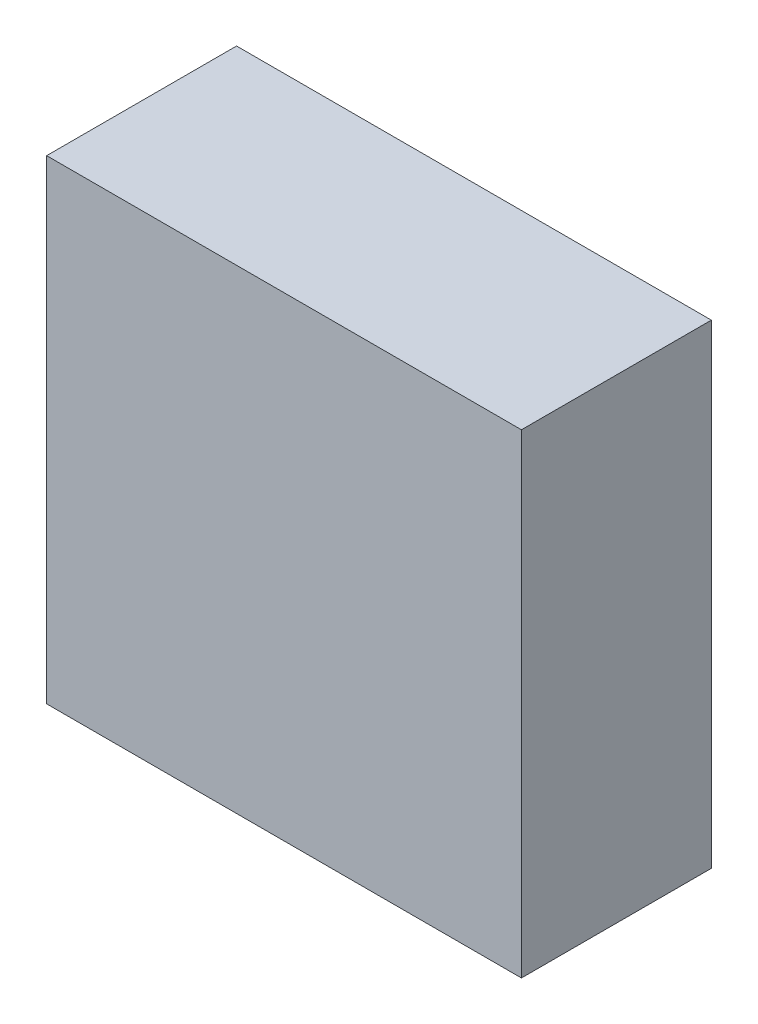
ISO-10303-21;
HEADER;
FILE_DESCRIPTION(('STEP AP214'),'2;1');
FILE_NAME('part.step','',(''),(''),'','','');
FILE_SCHEMA(('AUTOMOTIVE_DESIGN { 1 0 10303 214 1 1 1 1 }'));
ENDSEC;
DATA;
#1=APPLICATION_CONTEXT('core data for automotive mechanical design processes');
#2=APPLICATION_PROTOCOL_DEFINITION('international standard','automotive_design',2000,#1);
#3=PRODUCT_CONTEXT('',#1,'mechanical');
#4=PRODUCT('Part','Part','',(#3));
#5=PRODUCT_RELATED_PRODUCT_CATEGORY('part','',(#4));
#6=PRODUCT_DEFINITION_FORMATION('','',#4);
#7=PRODUCT_DEFINITION_CONTEXT('part definition',#1,'design');
#8=PRODUCT_DEFINITION('design','',#6,#7);
#9=PRODUCT_DEFINITION_SHAPE('','',#8);
#10=(LENGTH_UNIT() NAMED_UNIT(*) SI_UNIT(.MILLI.,.METRE.));
#11=(NAMED_UNIT(*) PLANE_ANGLE_UNIT() SI_UNIT($,.RADIAN.));
#12=(NAMED_UNIT(*) SI_UNIT($,.STERADIAN.) SOLID_ANGLE_UNIT());
#13=UNCERTAINTY_MEASURE_WITH_UNIT(LENGTH_MEASURE(1.E-05),#10,'distance_accuracy_value','');
#14=(GEOMETRIC_REPRESENTATION_CONTEXT(3) GLOBAL_UNCERTAINTY_ASSIGNED_CONTEXT((#13)) GLOBAL_UNIT_ASSIGNED_CONTEXT((#10,
#11,#12)) REPRESENTATION_CONTEXT('',''));
#15=CARTESIAN_POINT('',(0.,0.,0.));
#16=DIRECTION('',(0.,0.,1.));
#17=DIRECTION('',(1.,0.,0.));
#18=AXIS2_PLACEMENT_3D('',#15,#16,#17);
#19=CARTESIAN_POINT('',(0.,0.,400.));
#20=DIRECTION('',(1.,0.,0.));
#21=DIRECTION('',(0.,0.,-1.));
#22=AXIS2_PLACEMENT_3D('',#19,#20,#21);
#23=PLANE('',#22);
#24=DIRECTION('',(0.,-1.,0.));
#25=VECTOR('',#24,1.);
#26=CARTESIAN_POINT('',(0.,0.,0.));
#27=LINE('',#26,#25);
#28=CARTESIAN_POINT('',(0.,1000.,0.));
#29=VERTEX_POINT('',#28);
#30=CARTESIAN_POINT('',(0.,0.,0.));
#31=VERTEX_POINT('',#30);
#32=EDGE_CURVE('E113',#29,#31,#27,.T.);
#33=ORIENTED_EDGE('',*,*,#32,.T.);
#34=DIRECTION('',(0.,0.,-1.));
#35=VECTOR('',#34,1.);
#36=CARTESIAN_POINT('',(0.,0.,400.));
#37=LINE('',#36,#35);
#38=CARTESIAN_POINT('',(0.,0.,400.));
#39=VERTEX_POINT('',#38);
#40=EDGE_CURVE('E11',#39,#31,#37,.T.);
#41=ORIENTED_EDGE('',*,*,#40,.F.);
#42=DIRECTION('',(0.,-1.,0.));
#43=VECTOR('',#42,1.);
#44=CARTESIAN_POINT('',(0.,0.,400.));
#45=LINE('',#44,#43);
#46=CARTESIAN_POINT('',(0.,1000.,400.));
#47=VERTEX_POINT('',#46);
#48=EDGE_CURVE('E97',#47,#39,#45,.T.);
#49=ORIENTED_EDGE('',*,*,#48,.F.);
#50=DIRECTION('',(0.,0.,-1.));
#51=VECTOR('',#50,1.);
#52=CARTESIAN_POINT('',(0.,1000.,400.));
#53=LINE('',#52,#51);
#54=EDGE_CURVE('E109',#47,#29,#53,.T.);
#55=ORIENTED_EDGE('',*,*,#54,.T.);
#56=EDGE_LOOP('',(#33,#41,#49,#55));
#57=FACE_BOUND('',#56,.T.);
#58=ADVANCED_FACE('F45',(#57),#23,.F.);
#59=CARTESIAN_POINT('',(0.,0.,400.));
#60=DIRECTION('',(0.,1.,0.));
#61=DIRECTION('',(0.,0.,1.));
#62=AXIS2_PLACEMENT_3D('',#59,#60,#61);
#63=PLANE('',#62);
#64=DIRECTION('',(1.,0.,0.));
#65=VECTOR('',#64,1.);
#66=CARTESIAN_POINT('',(0.,0.,0.));
#67=LINE('',#66,#65);
#68=CARTESIAN_POINT('',(1000.,0.,0.));
#69=VERTEX_POINT('',#68);
#70=EDGE_CURVE('E102',#31,#69,#67,.T.);
#71=ORIENTED_EDGE('',*,*,#70,.T.);
#72=DIRECTION('',(0.,0.,-1.));
#73=VECTOR('',#72,1.);
#74=CARTESIAN_POINT('',(1000.,0.,400.));
#75=LINE('',#74,#73);
#76=CARTESIAN_POINT('',(1000.,0.,400.));
#77=VERTEX_POINT('',#76);
#78=EDGE_CURVE('E54',#77,#69,#75,.T.);
#79=ORIENTED_EDGE('',*,*,#78,.F.);
#80=DIRECTION('',(1.,0.,0.));
#81=VECTOR('',#80,1.);
#82=CARTESIAN_POINT('',(0.,0.,400.));
#83=LINE('',#82,#81);
#84=EDGE_CURVE('E92',#39,#77,#83,.T.);
#85=ORIENTED_EDGE('',*,*,#84,.F.);
#86=ORIENTED_EDGE('',*,*,#40,.T.);
#87=EDGE_LOOP('',(#71,#79,#85,#86));
#88=FACE_BOUND('',#87,.T.);
#89=ADVANCED_FACE('F101',(#88),#63,.F.);
#90=CARTESIAN_POINT('',(1000.,0.,400.));
#91=DIRECTION('',(-1.,0.,0.));
#92=DIRECTION('',(0.,0.,1.));
#93=AXIS2_PLACEMENT_3D('',#90,#91,#92);
#94=PLANE('',#93);
#95=DIRECTION('',(0.,1.,0.));
#96=VECTOR('',#95,1.);
#97=CARTESIAN_POINT('',(1000.,0.,0.));
#98=LINE('',#97,#96);
#99=CARTESIAN_POINT('',(1000.,1000.,0.));
#100=VERTEX_POINT('',#99);
#101=EDGE_CURVE('E79',#69,#100,#98,.T.);
#102=ORIENTED_EDGE('',*,*,#101,.T.);
#103=DIRECTION('',(0.,0.,-1.));
#104=VECTOR('',#103,1.);
#105=CARTESIAN_POINT('',(1000.,1000.,400.));
#106=LINE('',#105,#104);
#107=CARTESIAN_POINT('',(1000.,1000.,400.));
#108=VERTEX_POINT('',#107);
#109=EDGE_CURVE('E104',#108,#100,#106,.T.);
#110=ORIENTED_EDGE('',*,*,#109,.F.);
#111=DIRECTION('',(0.,1.,0.));
#112=VECTOR('',#111,1.);
#113=CARTESIAN_POINT('',(1000.,0.,400.));
#114=LINE('',#113,#112);
#115=EDGE_CURVE('E95',#77,#108,#114,.T.);
#116=ORIENTED_EDGE('',*,*,#115,.F.);
#117=ORIENTED_EDGE('',*,*,#78,.T.);
#118=EDGE_LOOP('',(#102,#110,#116,#117));
#119=FACE_BOUND('',#118,.T.);
#120=ADVANCED_FACE('F105',(#119),#94,.F.);
#121=CARTESIAN_POINT('',(0.,1000.,400.));
#122=DIRECTION('',(0.,-1.,0.));
#123=DIRECTION('',(0.,0.,-1.));
#124=AXIS2_PLACEMENT_3D('',#121,#122,#123);
#125=PLANE('',#124);
#126=DIRECTION('',(-1.,0.,0.));
#127=VECTOR('',#126,1.);
#128=CARTESIAN_POINT('',(0.,1000.,0.));
#129=LINE('',#128,#127);
#130=EDGE_CURVE('E85',#100,#29,#129,.T.);
#131=ORIENTED_EDGE('',*,*,#130,.T.);
#132=ORIENTED_EDGE('',*,*,#54,.F.);
#133=DIRECTION('',(-1.,0.,0.));
#134=VECTOR('',#133,1.);
#135=CARTESIAN_POINT('',(0.,1000.,400.));
#136=LINE('',#135,#134);
#137=EDGE_CURVE('E62',#108,#47,#136,.T.);
#138=ORIENTED_EDGE('',*,*,#137,.F.);
#139=ORIENTED_EDGE('',*,*,#109,.T.);
#140=EDGE_LOOP('',(#131,#132,#138,#139));
#141=FACE_BOUND('',#140,.T.);
#142=ADVANCED_FACE('F126',(#141),#125,.F.);
#143=CARTESIAN_POINT('',(0.,0.,400.));
#144=DIRECTION('',(0.,0.,-1.));
#145=DIRECTION('',(-1.,0.,0.));
#146=AXIS2_PLACEMENT_3D('',#143,#144,#145);
#147=PLANE('',#146);
#148=ORIENTED_EDGE('',*,*,#48,.T.);
#149=ORIENTED_EDGE('',*,*,#84,.T.);
#150=ORIENTED_EDGE('',*,*,#115,.T.);
#151=ORIENTED_EDGE('',*,*,#137,.T.);
#152=EDGE_LOOP('',(#148,#149,#150,#151));
#153=FACE_BOUND('',#152,.T.);
#154=ADVANCED_FACE('F93',(#153),#147,.F.);
#155=CARTESIAN_POINT('',(0.,0.,0.));
#156=DIRECTION('',(0.,0.,-1.));
#157=DIRECTION('',(-1.,0.,0.));
#158=AXIS2_PLACEMENT_3D('',#155,#156,#157);
#159=PLANE('',#158);
#160=ORIENTED_EDGE('',*,*,#32,.F.);
#161=ORIENTED_EDGE('',*,*,#130,.F.);
#162=ORIENTED_EDGE('',*,*,#101,.F.);
#163=ORIENTED_EDGE('',*,*,#70,.F.);
#164=EDGE_LOOP('',(#160,#161,#162,#163));
#165=FACE_BOUND('',#164,.T.);
#166=ADVANCED_FACE('F129',(#165),#159,.T.);
#167=CLOSED_SHELL('',(#58,#89,#120,#142,#154,#166));
#168=MANIFOLD_SOLID_BREP('B2',#167);
#169=ADVANCED_BREP_SHAPE_REPRESENTATION('',(#18,#168),#14);
#170=SHAPE_DEFINITION_REPRESENTATION(#9,#169);
ENDSEC;
END-ISO-10303-21;
